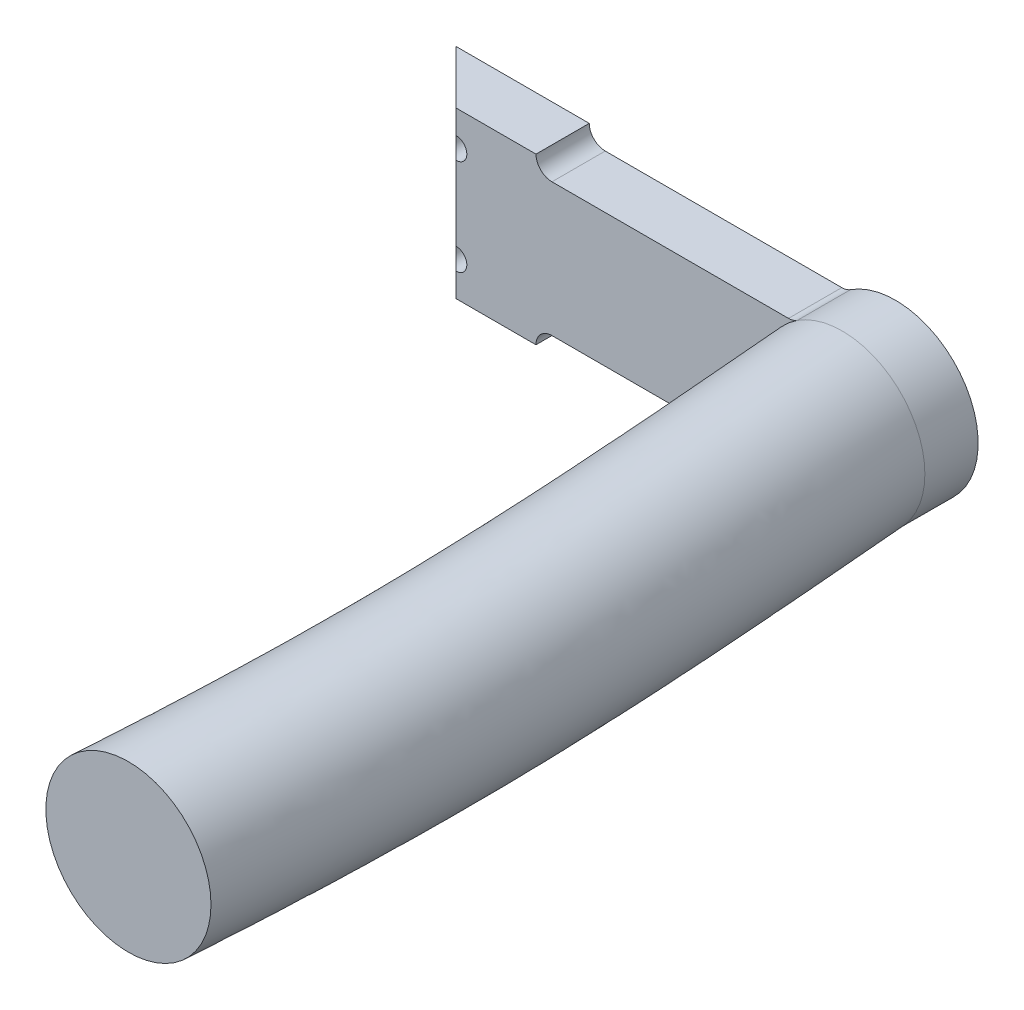
ISO-10303-21;
HEADER;
FILE_DESCRIPTION(('STEP AP214'),'2;1');
FILE_NAME('part.step','',(''),(''),'','','');
FILE_SCHEMA(('AUTOMOTIVE_DESIGN { 1 0 10303 214 1 1 1 1 }'));
ENDSEC;
DATA;
#1=APPLICATION_CONTEXT('core data for automotive mechanical design processes');
#2=APPLICATION_PROTOCOL_DEFINITION('international standard','automotive_design',2000,#1);
#3=PRODUCT_CONTEXT('',#1,'mechanical');
#4=PRODUCT('Part','Part','',(#3));
#5=PRODUCT_RELATED_PRODUCT_CATEGORY('part','',(#4));
#6=PRODUCT_DEFINITION_FORMATION('','',#4);
#7=PRODUCT_DEFINITION_CONTEXT('part definition',#1,'design');
#8=PRODUCT_DEFINITION('design','',#6,#7);
#9=PRODUCT_DEFINITION_SHAPE('','',#8);
#10=(LENGTH_UNIT() NAMED_UNIT(*) SI_UNIT(.MILLI.,.METRE.));
#11=(NAMED_UNIT(*) PLANE_ANGLE_UNIT() SI_UNIT($,.RADIAN.));
#12=(NAMED_UNIT(*) SI_UNIT($,.STERADIAN.) SOLID_ANGLE_UNIT());
#13=UNCERTAINTY_MEASURE_WITH_UNIT(LENGTH_MEASURE(1.E-05),#10,'distance_accuracy_value','');
#14=(GEOMETRIC_REPRESENTATION_CONTEXT(3) GLOBAL_UNCERTAINTY_ASSIGNED_CONTEXT((#13)) GLOBAL_UNIT_ASSIGNED_CONTEXT((#10,
#11,#12)) REPRESENTATION_CONTEXT('',''));
#15=CARTESIAN_POINT('',(0.,0.,0.));
#16=DIRECTION('',(0.,0.,1.));
#17=DIRECTION('',(1.,0.,0.));
#18=AXIS2_PLACEMENT_3D('',#15,#16,#17);
#19=CARTESIAN_POINT('',(25.,-15.5,10.));
#20=DIRECTION('',(0.,1.,0.));
#21=DIRECTION('',(-1.,0.,0.));
#22=AXIS2_PLACEMENT_3D('',#19,#20,#21);
#23=PLANE('',#22);
#24=DIRECTION('',(1.,0.,0.));
#25=VECTOR('',#24,1.);
#26=CARTESIAN_POINT('',(25.,-15.5,10.));
#27=LINE('',#26,#25);
#28=CARTESIAN_POINT('',(10.,-15.5,10.));
#29=VERTEX_POINT('',#28);
#30=CARTESIAN_POINT('',(25.,-15.5,10.));
#31=VERTEX_POINT('',#30);
#32=EDGE_CURVE('E224',#29,#31,#27,.T.);
#33=ORIENTED_EDGE('',*,*,#32,.F.);
#34=DIRECTION('',(-0.707106781186547,0.,-0.707106781186549));
#35=VECTOR('',#34,1.);
#36=CARTESIAN_POINT('',(10.,-15.5,10.));
#37=LINE('',#36,#35);
#38=CARTESIAN_POINT('',(0.,-15.5,0.));
#39=VERTEX_POINT('',#38);
#40=EDGE_CURVE('E206',#29,#39,#37,.T.);
#41=ORIENTED_EDGE('',*,*,#40,.T.);
#42=DIRECTION('',(1.,0.,0.));
#43=VECTOR('',#42,1.);
#44=CARTESIAN_POINT('',(25.,-15.5,0.));
#45=LINE('',#44,#43);
#46=CARTESIAN_POINT('',(25.,-15.5,0.));
#47=VERTEX_POINT('',#46);
#48=EDGE_CURVE('E223',#39,#47,#45,.T.);
#49=ORIENTED_EDGE('',*,*,#48,.T.);
#50=DIRECTION('',(0.,0.,-1.));
#51=VECTOR('',#50,1.);
#52=CARTESIAN_POINT('',(25.,-15.5,10.));
#53=LINE('',#52,#51);
#54=EDGE_CURVE('E195',#31,#47,#53,.T.);
#55=ORIENTED_EDGE('',*,*,#54,.F.);
#56=EDGE_LOOP('',(#33,#41,#49,#55));
#57=FACE_BOUND('',#56,.T.);
#58=ADVANCED_FACE('F54',(#57),#23,.F.);
#59=CARTESIAN_POINT('',(28.,-15.5,10.));
#60=DIRECTION('',(0.,0.,-1.));
#61=DIRECTION('',(-1.,0.,0.));
#62=AXIS2_PLACEMENT_3D('',#59,#60,#61);
#63=CYLINDRICAL_SURFACE('',#62,3.);
#64=CARTESIAN_POINT('',(28.,-15.5,0.));
#65=DIRECTION('',(0.,0.,-1.));
#66=DIRECTION('',(1.,0.,0.));
#67=AXIS2_PLACEMENT_3D('',#64,#65,#66);
#68=CIRCLE('',#67,3.);
#69=CARTESIAN_POINT('',(28.,-12.5,0.));
#70=VERTEX_POINT('',#69);
#71=EDGE_CURVE('E239',#47,#70,#68,.T.);
#72=ORIENTED_EDGE('',*,*,#71,.T.);
#73=DIRECTION('',(0.,0.,-1.));
#74=VECTOR('',#73,1.);
#75=CARTESIAN_POINT('',(28.,-12.5,10.));
#76=LINE('',#75,#74);
#77=CARTESIAN_POINT('',(28.,-12.5,10.));
#78=VERTEX_POINT('',#77);
#79=EDGE_CURVE('E189',#78,#70,#76,.T.);
#80=ORIENTED_EDGE('',*,*,#79,.F.);
#81=CARTESIAN_POINT('',(28.,-15.5,10.));
#82=DIRECTION('',(0.,0.,-1.));
#83=DIRECTION('',(1.,0.,0.));
#84=AXIS2_PLACEMENT_3D('',#81,#82,#83);
#85=CIRCLE('',#84,3.);
#86=EDGE_CURVE('E226',#31,#78,#85,.T.);
#87=ORIENTED_EDGE('',*,*,#86,.F.);
#88=ORIENTED_EDGE('',*,*,#54,.T.);
#89=EDGE_LOOP('',(#72,#80,#87,#88));
#90=FACE_BOUND('',#89,.T.);
#91=ADVANCED_FACE('F290',(#90),#63,.F.);
#92=CARTESIAN_POINT('',(72.4004950616379,-12.5,10.));
#93=DIRECTION('',(0.,1.,0.));
#94=DIRECTION('',(0.,0.,1.));
#95=AXIS2_PLACEMENT_3D('',#92,#93,#94);
#96=PLANE('',#95);
#97=DIRECTION('',(1.,0.,0.));
#98=VECTOR('',#97,1.);
#99=CARTESIAN_POINT('',(72.4004950616379,-12.5,0.));
#100=LINE('',#99,#98);
#101=CARTESIAN_POINT('',(72.4004950616379,-12.5,0.));
#102=VERTEX_POINT('',#101);
#103=EDGE_CURVE('E241',#70,#102,#100,.T.);
#104=ORIENTED_EDGE('',*,*,#103,.T.);
#105=DIRECTION('',(0.,0.,-1.));
#106=VECTOR('',#105,1.);
#107=CARTESIAN_POINT('',(72.4004950616379,-12.5,10.));
#108=LINE('',#107,#106);
#109=CARTESIAN_POINT('',(72.4004950616379,-12.5,10.));
#110=VERTEX_POINT('',#109);
#111=EDGE_CURVE('E187',#110,#102,#108,.T.);
#112=ORIENTED_EDGE('',*,*,#111,.F.);
#113=DIRECTION('',(1.,0.,0.));
#114=VECTOR('',#113,1.);
#115=CARTESIAN_POINT('',(72.4004950616379,-12.5,10.));
#116=LINE('',#115,#114);
#117=EDGE_CURVE('E179',#78,#110,#116,.T.);
#118=ORIENTED_EDGE('',*,*,#117,.F.);
#119=ORIENTED_EDGE('',*,*,#79,.T.);
#120=EDGE_LOOP('',(#104,#112,#118,#119));
#121=FACE_BOUND('',#120,.T.);
#122=ADVANCED_FACE('F294',(#121),#96,.F.);
#123=CARTESIAN_POINT('',(72.4004950616379,-15.5,10.));
#124=DIRECTION('',(0.,0.,-1.));
#125=DIRECTION('',(-1.,0.,0.));
#126=AXIS2_PLACEMENT_3D('',#123,#124,#125);
#127=CYLINDRICAL_SURFACE('',#126,3.);
#128=CARTESIAN_POINT('',(72.4004950616379,-15.5,0.));
#129=DIRECTION('',(0.,0.,-1.));
#130=DIRECTION('',(1.,0.,0.));
#131=AXIS2_PLACEMENT_3D('',#128,#129,#130);
#132=CIRCLE('',#131,3.);
#133=CARTESIAN_POINT('',(74.0382526192102,-12.9864864864865,0.));
#134=VERTEX_POINT('',#133);
#135=EDGE_CURVE('E243',#102,#134,#132,.T.);
#136=ORIENTED_EDGE('',*,*,#135,.T.);
#137=DIRECTION('',(0.,0.,-1.));
#138=VECTOR('',#137,1.);
#139=CARTESIAN_POINT('',(74.0382526192102,-12.9864864864865,10.));
#140=LINE('',#139,#138);
#141=CARTESIAN_POINT('',(74.0382526192102,-12.9864864864865,10.));
#142=VERTEX_POINT('',#141);
#143=EDGE_CURVE('E165',#142,#134,#140,.T.);
#144=ORIENTED_EDGE('',*,*,#143,.F.);
#145=CARTESIAN_POINT('',(72.4004950616379,-15.5,10.));
#146=DIRECTION('',(0.,0.,-1.));
#147=DIRECTION('',(1.,0.,0.));
#148=AXIS2_PLACEMENT_3D('',#145,#146,#147);
#149=CIRCLE('',#148,3.);
#150=EDGE_CURVE('E170',#110,#142,#149,.T.);
#151=ORIENTED_EDGE('',*,*,#150,.F.);
#152=ORIENTED_EDGE('',*,*,#111,.T.);
#153=EDGE_LOOP('',(#136,#144,#151,#152));
#154=FACE_BOUND('',#153,.T.);
#155=ADVANCED_FACE('F296',(#154),#127,.F.);
#156=CARTESIAN_POINT('',(82.5,0.,10.));
#157=DIRECTION('',(0.,0.,-1.));
#158=DIRECTION('',(-1.,0.,0.));
#159=AXIS2_PLACEMENT_3D('',#156,#157,#158);
#160=CYLINDRICAL_SURFACE('',#159,15.5);
#161=CARTESIAN_POINT('',(82.5,0.,0.));
#162=DIRECTION('',(0.,0.,1.));
#163=DIRECTION('',(-1.,0.,0.));
#164=AXIS2_PLACEMENT_3D('',#161,#162,#163);
#165=CIRCLE('',#164,15.5);
#166=CARTESIAN_POINT('',(74.0382526192102,12.9864864864865,0.));
#167=VERTEX_POINT('',#166);
#168=EDGE_CURVE('E164',#134,#167,#165,.T.);
#169=ORIENTED_EDGE('',*,*,#168,.T.);
#170=DIRECTION('',(0.,0.,-1.));
#171=VECTOR('',#170,1.);
#172=CARTESIAN_POINT('',(74.0382526192102,12.9864864864865,10.));
#173=LINE('',#172,#171);
#174=CARTESIAN_POINT('',(74.0382526192102,12.9864864864865,10.));
#175=VERTEX_POINT('',#174);
#176=EDGE_CURVE('E147',#175,#167,#173,.T.);
#177=ORIENTED_EDGE('',*,*,#176,.F.);
#178=CARTESIAN_POINT('',(82.5,0.,10.));
#179=DIRECTION('',(0.,0.,1.));
#180=DIRECTION('',(-1.,0.,0.));
#181=AXIS2_PLACEMENT_3D('',#178,#179,#180);
#182=CIRCLE('',#181,15.5);
#183=EDGE_CURVE('E155',#142,#175,#182,.T.);
#184=ORIENTED_EDGE('',*,*,#183,.F.);
#185=ORIENTED_EDGE('',*,*,#143,.T.);
#186=EDGE_LOOP('',(#169,#177,#184,#185));
#187=FACE_BOUND('',#186,.T.);
#188=ADVANCED_FACE('F159',(#187),#160,.T.);
#189=CARTESIAN_POINT('',(72.4004950616379,15.5,10.));
#190=DIRECTION('',(0.,0.,-1.));
#191=DIRECTION('',(-1.,0.,0.));
#192=AXIS2_PLACEMENT_3D('',#189,#190,#191);
#193=CYLINDRICAL_SURFACE('',#192,3.);
#194=CARTESIAN_POINT('',(72.4004950616379,15.5,0.));
#195=DIRECTION('',(0.,0.,-1.));
#196=DIRECTION('',(1.,0.,0.));
#197=AXIS2_PLACEMENT_3D('',#194,#195,#196);
#198=CIRCLE('',#197,3.);
#199=CARTESIAN_POINT('',(72.4004950616379,12.5,0.));
#200=VERTEX_POINT('',#199);
#201=EDGE_CURVE('E246',#167,#200,#198,.T.);
#202=ORIENTED_EDGE('',*,*,#201,.T.);
#203=DIRECTION('',(0.,0.,-1.));
#204=VECTOR('',#203,1.);
#205=CARTESIAN_POINT('',(72.4004950616379,12.5,10.));
#206=LINE('',#205,#204);
#207=CARTESIAN_POINT('',(72.4004950616379,12.5,10.));
#208=VERTEX_POINT('',#207);
#209=EDGE_CURVE('E150',#208,#200,#206,.T.);
#210=ORIENTED_EDGE('',*,*,#209,.F.);
#211=CARTESIAN_POINT('',(72.4004950616379,15.5,10.));
#212=DIRECTION('',(0.,0.,-1.));
#213=DIRECTION('',(1.,0.,0.));
#214=AXIS2_PLACEMENT_3D('',#211,#212,#213);
#215=CIRCLE('',#214,3.);
#216=EDGE_CURVE('E144',#175,#208,#215,.T.);
#217=ORIENTED_EDGE('',*,*,#216,.F.);
#218=ORIENTED_EDGE('',*,*,#176,.T.);
#219=EDGE_LOOP('',(#202,#210,#217,#218));
#220=FACE_BOUND('',#219,.T.);
#221=ADVANCED_FACE('F146',(#220),#193,.F.);
#222=CARTESIAN_POINT('',(28.,12.5,10.));
#223=DIRECTION('',(0.,-1.,0.));
#224=DIRECTION('',(0.,0.,-1.));
#225=AXIS2_PLACEMENT_3D('',#222,#223,#224);
#226=PLANE('',#225);
#227=DIRECTION('',(-1.,0.,0.));
#228=VECTOR('',#227,1.);
#229=CARTESIAN_POINT('',(28.,12.5,0.));
#230=LINE('',#229,#228);
#231=CARTESIAN_POINT('',(28.,12.5,0.));
#232=VERTEX_POINT('',#231);
#233=EDGE_CURVE('E248',#200,#232,#230,.T.);
#234=ORIENTED_EDGE('',*,*,#233,.T.);
#235=DIRECTION('',(0.,0.,-1.));
#236=VECTOR('',#235,1.);
#237=CARTESIAN_POINT('',(28.,12.5,10.));
#238=LINE('',#237,#236);
#239=CARTESIAN_POINT('',(28.,12.5,10.));
#240=VERTEX_POINT('',#239);
#241=EDGE_CURVE('E257',#240,#232,#238,.T.);
#242=ORIENTED_EDGE('',*,*,#241,.F.);
#243=DIRECTION('',(-1.,0.,0.));
#244=VECTOR('',#243,1.);
#245=CARTESIAN_POINT('',(28.,12.5,10.));
#246=LINE('',#245,#244);
#247=EDGE_CURVE('E154',#208,#240,#246,.T.);
#248=ORIENTED_EDGE('',*,*,#247,.F.);
#249=ORIENTED_EDGE('',*,*,#209,.T.);
#250=EDGE_LOOP('',(#234,#242,#248,#249));
#251=FACE_BOUND('',#250,.T.);
#252=ADVANCED_FACE('F265',(#251),#226,.F.);
#253=CARTESIAN_POINT('',(28.,15.5,10.));
#254=DIRECTION('',(0.,0.,-1.));
#255=DIRECTION('',(-1.,0.,0.));
#256=AXIS2_PLACEMENT_3D('',#253,#254,#255);
#257=CYLINDRICAL_SURFACE('',#256,3.);
#258=CARTESIAN_POINT('',(28.,15.5,0.));
#259=DIRECTION('',(0.,0.,-1.));
#260=DIRECTION('',(1.,0.,0.));
#261=AXIS2_PLACEMENT_3D('',#258,#259,#260);
#262=CIRCLE('',#261,3.);
#263=CARTESIAN_POINT('',(25.,15.5,0.));
#264=VERTEX_POINT('',#263);
#265=EDGE_CURVE('E250',#232,#264,#262,.T.);
#266=ORIENTED_EDGE('',*,*,#265,.T.);
#267=DIRECTION('',(0.,0.,-1.));
#268=VECTOR('',#267,1.);
#269=CARTESIAN_POINT('',(25.,15.5,10.));
#270=LINE('',#269,#268);
#271=CARTESIAN_POINT('',(25.,15.5,10.));
#272=VERTEX_POINT('',#271);
#273=EDGE_CURVE('E236',#272,#264,#270,.T.);
#274=ORIENTED_EDGE('',*,*,#273,.F.);
#275=CARTESIAN_POINT('',(28.,15.5,10.));
#276=DIRECTION('',(0.,0.,-1.));
#277=DIRECTION('',(1.,0.,0.));
#278=AXIS2_PLACEMENT_3D('',#275,#276,#277);
#279=CIRCLE('',#278,3.);
#280=EDGE_CURVE('E231',#240,#272,#279,.T.);
#281=ORIENTED_EDGE('',*,*,#280,.F.);
#282=ORIENTED_EDGE('',*,*,#241,.T.);
#283=EDGE_LOOP('',(#266,#274,#281,#282));
#284=FACE_BOUND('',#283,.T.);
#285=ADVANCED_FACE('F272',(#284),#257,.F.);
#286=CARTESIAN_POINT('',(0.,15.5,10.));
#287=DIRECTION('',(0.,-1.,0.));
#288=DIRECTION('',(0.,0.,-1.));
#289=AXIS2_PLACEMENT_3D('',#286,#287,#288);
#290=PLANE('',#289);
#291=DIRECTION('',(-1.,0.,0.));
#292=VECTOR('',#291,1.);
#293=CARTESIAN_POINT('',(0.,15.5,0.));
#294=LINE('',#293,#292);
#295=CARTESIAN_POINT('',(0.,15.5,0.));
#296=VERTEX_POINT('',#295);
#297=EDGE_CURVE('E252',#264,#296,#294,.T.);
#298=ORIENTED_EDGE('',*,*,#297,.T.);
#299=DIRECTION('',(0.707106781186547,0.,0.707106781186549));
#300=VECTOR('',#299,1.);
#301=CARTESIAN_POINT('',(10.,15.5,10.));
#302=LINE('',#301,#300);
#303=CARTESIAN_POINT('',(10.,15.5,10.));
#304=VERTEX_POINT('',#303);
#305=EDGE_CURVE('E63',#296,#304,#302,.T.);
#306=ORIENTED_EDGE('',*,*,#305,.T.);
#307=DIRECTION('',(-1.,0.,0.));
#308=VECTOR('',#307,1.);
#309=CARTESIAN_POINT('',(0.,15.5,10.));
#310=LINE('',#309,#308);
#311=EDGE_CURVE('E233',#272,#304,#310,.T.);
#312=ORIENTED_EDGE('',*,*,#311,.F.);
#313=ORIENTED_EDGE('',*,*,#273,.T.);
#314=EDGE_LOOP('',(#298,#306,#312,#313));
#315=FACE_BOUND('',#314,.T.);
#316=ADVANCED_FACE('F275',(#315),#290,.F.);
#317=CARTESIAN_POINT('',(28.,15.5,10.));
#318=DIRECTION('',(0.,0.,1.));
#319=DIRECTION('',(1.,0.,0.));
#320=AXIS2_PLACEMENT_3D('',#317,#318,#319);
#321=PLANE('',#320);
#322=CARTESIAN_POINT('',(82.5,0.,10.));
#323=DIRECTION('',(0.,0.,1.));
#324=DIRECTION('',(1.,0.,0.));
#325=AXIS2_PLACEMENT_3D('',#322,#323,#324);
#326=CIRCLE('',#325,15.5);
#327=EDGE_CURVE('E167',#175,#142,#326,.T.);
#328=ORIENTED_EDGE('',*,*,#327,.F.);
#329=ORIENTED_EDGE('',*,*,#216,.T.);
#330=ORIENTED_EDGE('',*,*,#247,.T.);
#331=ORIENTED_EDGE('',*,*,#280,.T.);
#332=ORIENTED_EDGE('',*,*,#311,.T.);
#333=DIRECTION('',(0.,-1.,0.));
#334=VECTOR('',#333,1.);
#335=CARTESIAN_POINT('',(10.,-15.5,10.));
#336=LINE('',#335,#334);
#337=CARTESIAN_POINT('',(10.,11.0193,10.));
#338=VERTEX_POINT('',#337);
#339=EDGE_CURVE('E203',#304,#338,#336,.T.);
#340=ORIENTED_EDGE('',*,*,#339,.T.);
#341=CARTESIAN_POINT('',(10.,9.,10.));
#342=DIRECTION('',(0.,0.,1.));
#343=DIRECTION('',(1.,0.,0.));
#344=AXIS2_PLACEMENT_3D('',#341,#342,#343);
#345=CIRCLE('',#344,2.0193);
#346=CARTESIAN_POINT('',(10.,6.9807,10.));
#347=VERTEX_POINT('',#346);
#348=EDGE_CURVE('E76',#347,#338,#345,.T.);
#349=ORIENTED_EDGE('',*,*,#348,.F.);
#350=CARTESIAN_POINT('',(10.,-6.9807,10.));
#351=VERTEX_POINT('',#350);
#352=EDGE_CURVE('E207',#347,#351,#336,.T.);
#353=ORIENTED_EDGE('',*,*,#352,.T.);
#354=CARTESIAN_POINT('',(10.,-9.,10.));
#355=DIRECTION('',(0.,0.,1.));
#356=DIRECTION('',(1.,0.,0.));
#357=AXIS2_PLACEMENT_3D('',#354,#355,#356);
#358=CIRCLE('',#357,2.0193);
#359=CARTESIAN_POINT('',(10.,-11.0193,10.));
#360=VERTEX_POINT('',#359);
#361=EDGE_CURVE('E69',#360,#351,#358,.T.);
#362=ORIENTED_EDGE('',*,*,#361,.F.);
#363=EDGE_CURVE('E202',#360,#29,#336,.T.);
#364=ORIENTED_EDGE('',*,*,#363,.T.);
#365=ORIENTED_EDGE('',*,*,#32,.T.);
#366=ORIENTED_EDGE('',*,*,#86,.T.);
#367=ORIENTED_EDGE('',*,*,#117,.T.);
#368=ORIENTED_EDGE('',*,*,#150,.T.);
#369=EDGE_LOOP('',(#328,#329,#330,#331,#332,#340,#349,#353,#362,#364,#365,#366,#367,#368));
#370=FACE_BOUND('',#369,.T.);
#371=ADVANCED_FACE('F168',(#370),#321,.T.);
#372=CARTESIAN_POINT('',(28.,15.5,0.));
#373=DIRECTION('',(0.,0.,1.));
#374=DIRECTION('',(1.,0.,0.));
#375=AXIS2_PLACEMENT_3D('',#372,#373,#374);
#376=PLANE('',#375);
#377=CARTESIAN_POINT('',(10.,-9.,0.));
#378=DIRECTION('',(0.,0.,-1.));
#379=DIRECTION('',(-1.,0.,0.));
#380=AXIS2_PLACEMENT_3D('',#377,#378,#379);
#381=CIRCLE('',#380,2.0193);
#382=CARTESIAN_POINT('',(7.98070000000001,-9.,0.));
#383=VERTEX_POINT('',#382);
#384=EDGE_CURVE('E173',#383,#383,#381,.T.);
#385=ORIENTED_EDGE('',*,*,#384,.F.);
#386=EDGE_LOOP('',(#385));
#387=FACE_BOUND('',#386,.T.);
#388=CARTESIAN_POINT('',(10.,9.,0.));
#389=DIRECTION('',(0.,0.,-1.));
#390=DIRECTION('',(-1.,0.,0.));
#391=AXIS2_PLACEMENT_3D('',#388,#389,#390);
#392=CIRCLE('',#391,2.0193);
#393=CARTESIAN_POINT('',(7.98070000000001,9.,0.));
#394=VERTEX_POINT('',#393);
#395=EDGE_CURVE('E217',#394,#394,#392,.T.);
#396=ORIENTED_EDGE('',*,*,#395,.F.);
#397=EDGE_LOOP('',(#396));
#398=FACE_BOUND('',#397,.T.);
#399=ORIENTED_EDGE('',*,*,#48,.F.);
#400=DIRECTION('',(0.,-1.,0.));
#401=VECTOR('',#400,1.);
#402=CARTESIAN_POINT('',(0.,-15.5,0.));
#403=LINE('',#402,#401);
#404=EDGE_CURVE('E227',#296,#39,#403,.T.);
#405=ORIENTED_EDGE('',*,*,#404,.F.);
#406=ORIENTED_EDGE('',*,*,#297,.F.);
#407=ORIENTED_EDGE('',*,*,#265,.F.);
#408=ORIENTED_EDGE('',*,*,#233,.F.);
#409=ORIENTED_EDGE('',*,*,#201,.F.);
#410=ORIENTED_EDGE('',*,*,#168,.F.);
#411=ORIENTED_EDGE('',*,*,#135,.F.);
#412=ORIENTED_EDGE('',*,*,#103,.F.);
#413=ORIENTED_EDGE('',*,*,#71,.F.);
#414=EDGE_LOOP('',(#399,#405,#406,#407,#408,#409,#410,#411,#412,#413));
#415=FACE_BOUND('',#414,.T.);
#416=ADVANCED_FACE('F268',(#387,#398,#415),#376,.F.);
#417=CARTESIAN_POINT('',(10.,15.5,10.));
#418=DIRECTION('',(-0.707106781186549,0.,0.707106781186547));
#419=DIRECTION('',(0.,1.,0.));
#420=AXIS2_PLACEMENT_3D('',#417,#418,#419);
#421=PLANE('',#420);
#422=CARTESIAN_POINT('',(10.,-9.,10.));
#423=DIRECTION('',(-0.707106781186549,0.,0.707106781186547));
#424=DIRECTION('',(-0.707106781186547,0.,-0.707106781186549));
#425=AXIS2_PLACEMENT_3D('',#422,#423,#424);
#426=ELLIPSE('',#425,2.85572144649999,2.0193);
#427=EDGE_CURVE('E12',#351,#360,#426,.T.);
#428=ORIENTED_EDGE('',*,*,#427,.F.);
#429=ORIENTED_EDGE('',*,*,#352,.F.);
#430=CARTESIAN_POINT('',(10.,9.,10.));
#431=DIRECTION('',(-0.707106781186549,0.,0.707106781186547));
#432=DIRECTION('',(-0.707106781186547,0.,-0.707106781186549));
#433=AXIS2_PLACEMENT_3D('',#430,#431,#432);
#434=ELLIPSE('',#433,2.85572144649999,2.0193);
#435=EDGE_CURVE('E220',#338,#347,#434,.T.);
#436=ORIENTED_EDGE('',*,*,#435,.F.);
#437=ORIENTED_EDGE('',*,*,#339,.F.);
#438=ORIENTED_EDGE('',*,*,#305,.F.);
#439=ORIENTED_EDGE('',*,*,#404,.T.);
#440=ORIENTED_EDGE('',*,*,#40,.F.);
#441=ORIENTED_EDGE('',*,*,#363,.F.);
#442=EDGE_LOOP('',(#428,#429,#436,#437,#438,#439,#440,#441));
#443=FACE_BOUND('',#442,.T.);
#444=ADVANCED_FACE('F56',(#443),#421,.T.);
#445=CARTESIAN_POINT('',(10.,9.,0.));
#446=DIRECTION('',(0.,0.,-1.));
#447=DIRECTION('',(-1.,0.,0.));
#448=AXIS2_PLACEMENT_3D('',#445,#446,#447);
#449=CYLINDRICAL_SURFACE('',#448,2.0193);
#450=ORIENTED_EDGE('',*,*,#348,.T.);
#451=ORIENTED_EDGE('',*,*,#435,.T.);
#452=EDGE_LOOP('',(#450,#451));
#453=FACE_BOUND('',#452,.T.);
#454=ORIENTED_EDGE('',*,*,#395,.T.);
#455=EDGE_LOOP('',(#454));
#456=FACE_BOUND('',#455,.T.);
#457=ADVANCED_FACE('F281',(#453,#456),#449,.F.);
#458=CARTESIAN_POINT('',(10.,-9.,0.));
#459=DIRECTION('',(0.,0.,-1.));
#460=DIRECTION('',(-1.,0.,0.));
#461=AXIS2_PLACEMENT_3D('',#458,#459,#460);
#462=CYLINDRICAL_SURFACE('',#461,2.0193);
#463=ORIENTED_EDGE('',*,*,#361,.T.);
#464=ORIENTED_EDGE('',*,*,#427,.T.);
#465=EDGE_LOOP('',(#463,#464));
#466=FACE_BOUND('',#465,.T.);
#467=ORIENTED_EDGE('',*,*,#384,.T.);
#468=EDGE_LOOP('',(#467));
#469=FACE_BOUND('',#468,.T.);
#470=ADVANCED_FACE('F375',(#466,#469),#462,.F.);
#471=CARTESIAN_POINT('',(85.5,0.,147.));
#472=DIRECTION('',(0.,0.,1.));
#473=DIRECTION('',(1.,0.,0.));
#474=AXIS2_PLACEMENT_3D('',#471,#472,#473);
#475=PLANE('',#474);
#476=CARTESIAN_POINT('',(85.5,0.,147.));
#477=DIRECTION('',(0.,0.,1.));
#478=DIRECTION('',(1.,0.,0.));
#479=AXIS2_PLACEMENT_3D('',#476,#477,#478);
#480=CIRCLE('',#479,15.5);
#481=CARTESIAN_POINT('',(101.,0.,147.));
#482=VERTEX_POINT('',#481);
#483=EDGE_CURVE('E174',#482,#482,#480,.T.);
#484=ORIENTED_EDGE('',*,*,#483,.T.);
#485=EDGE_LOOP('',(#484));
#486=FACE_BOUND('',#485,.T.);
#487=ADVANCED_FACE('F385',(#486),#475,.T.);
#488=CARTESIAN_POINT('',(98.,0.,10.));
#489=CARTESIAN_POINT('',(100.160836359369,0.,35.5363844552462));
#490=CARTESIAN_POINT('',(104.019472715385,0.,81.1370709824719));
#491=CARTESIAN_POINT('',(102.39890635279,0.,126.929899954831));
#492=CARTESIAN_POINT('',(101.,0.,147.));
#493=CARTESIAN_POINT('',(98.,31.,10.));
#494=CARTESIAN_POINT('',(100.160836359369,31.,35.5363844552462));
#495=CARTESIAN_POINT('',(104.019472715385,31.,81.137070982472));
#496=CARTESIAN_POINT('',(102.39890635279,31.,126.929899954831));
#497=CARTESIAN_POINT('',(101.,31.,147.));
#498=CARTESIAN_POINT('',(67.,31.,10.));
#499=CARTESIAN_POINT('',(69.1608363593691,31.,35.5363844552462));
#500=CARTESIAN_POINT('',(73.0194727153854,31.,81.137070982472));
#501=CARTESIAN_POINT('',(71.3989063527903,31.,126.929899954831));
#502=CARTESIAN_POINT('',(70.,31.,147.));
#503=CARTESIAN_POINT('',(67.,0.,10.));
#504=CARTESIAN_POINT('',(69.1608363593691,0.,35.5363844552462));
#505=CARTESIAN_POINT('',(73.0194727153854,0.,81.1370709824719));
#506=CARTESIAN_POINT('',(71.3989063527903,0.,126.929899954831));
#507=CARTESIAN_POINT('',(70.,0.,147.));
#508=CARTESIAN_POINT('',(67.,-31.,10.));
#509=CARTESIAN_POINT('',(69.1608363593691,-31.,35.5363844552462));
#510=CARTESIAN_POINT('',(73.0194727153854,-31.,81.137070982472));
#511=CARTESIAN_POINT('',(71.3989063527903,-31.,126.929899954831));
#512=CARTESIAN_POINT('',(70.,-31.,147.));
#513=CARTESIAN_POINT('',(98.,-31.,10.));
#514=CARTESIAN_POINT('',(100.160836359369,-31.,35.5363844552462));
#515=CARTESIAN_POINT('',(104.019472715385,-31.,81.137070982472));
#516=CARTESIAN_POINT('',(102.39890635279,-31.,126.929899954831));
#517=CARTESIAN_POINT('',(101.,-31.,147.));
#518=CARTESIAN_POINT('',(98.,0.,10.));
#519=CARTESIAN_POINT('',(100.160836359369,0.,35.5363844552462));
#520=CARTESIAN_POINT('',(104.019472715385,0.,81.1370709824719));
#521=CARTESIAN_POINT('',(102.39890635279,0.,126.929899954831));
#522=CARTESIAN_POINT('',(101.,0.,147.));
#523=(BOUNDED_SURFACE() B_SPLINE_SURFACE(3,3,((#488,#489,#490,#491,#492),(#493,#494,#495,#496,
#497),(#498,#499,#500,#501,#502),(#503,#504,#505,#506,#507),(#508,#509,#510,#511,#512),(#513,
#514,#515,#516,#517),(#518,#519,#520,#521,#522)),.UNSPECIFIED.,.T.,.F.,
.F.) B_SPLINE_SURFACE_WITH_KNOTS((4,3,4),(4,1,4),(0.,0.5,1.),(0.,0.559999999999995,1.),
.UNSPECIFIED.) GEOMETRIC_REPRESENTATION_ITEM() RATIONAL_B_SPLINE_SURFACE(((1.,1.,1.,1.,1.),
(0.333333333333333,0.333333333333333,0.333333333333333,0.333333333333333,0.333333333333333),
(0.333333333333333,0.333333333333333,0.333333333333333,0.333333333333333,0.333333333333333),(1.,
1.,1.,1.,1.),(0.333333333333333,0.333333333333333,0.333333333333333,0.333333333333333,
0.333333333333333),(0.333333333333333,0.333333333333333,0.333333333333333,0.333333333333333,
0.333333333333333),(1.,1.,1.,1.,1.))) REPRESENTATION_ITEM('') SURFACE());
#524=ORIENTED_EDGE('',*,*,#327,.T.);
#525=ORIENTED_EDGE('',*,*,#183,.T.);
#526=EDGE_LOOP('',(#524,#525));
#527=FACE_BOUND('',#526,.T.);
#528=ORIENTED_EDGE('',*,*,#483,.F.);
#529=EDGE_LOOP('',(#528));
#530=FACE_BOUND('',#529,.T.);
#531=ADVANCED_FACE('F176',(#527,#530),#523,.T.);
#532=CLOSED_SHELL('',(#58,#91,#122,#155,#188,#221,#252,#285,#316,#371,#416,#444,#457,#470,#487,#531));
#533=MANIFOLD_SOLID_BREP('B2',#532);
#534=ADVANCED_BREP_SHAPE_REPRESENTATION('',(#18,#533),#14);
#535=SHAPE_DEFINITION_REPRESENTATION(#9,#534);
ENDSEC;
END-ISO-10303-21;
